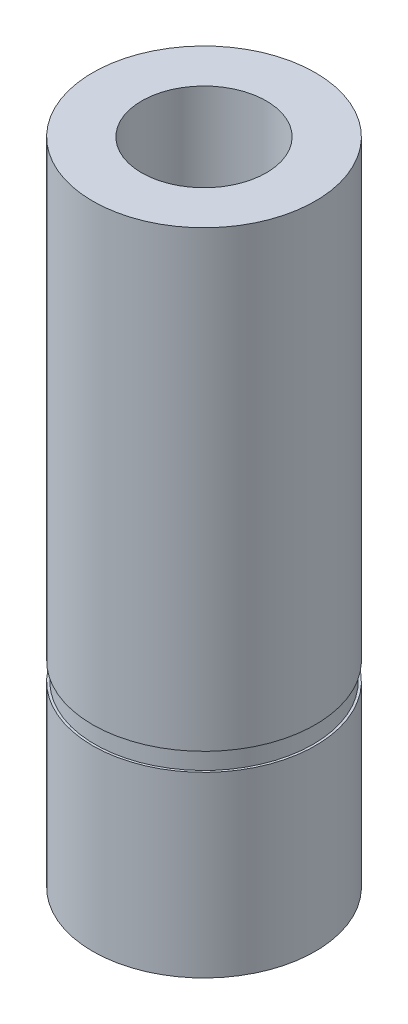
ISO-10303-21;
HEADER;
FILE_DESCRIPTION(('STEP AP214'),'2;1');
FILE_NAME('part.step','',(''),(''),'','','');
FILE_SCHEMA(('AUTOMOTIVE_DESIGN { 1 0 10303 214 1 1 1 1 }'));
ENDSEC;
DATA;
#1=APPLICATION_CONTEXT('core data for automotive mechanical design processes');
#2=APPLICATION_PROTOCOL_DEFINITION('international standard','automotive_design',2000,#1);
#3=PRODUCT_CONTEXT('',#1,'mechanical');
#4=PRODUCT('Part','Part','',(#3));
#5=PRODUCT_RELATED_PRODUCT_CATEGORY('part','',(#4));
#6=PRODUCT_DEFINITION_FORMATION('','',#4);
#7=PRODUCT_DEFINITION_CONTEXT('part definition',#1,'design');
#8=PRODUCT_DEFINITION('design','',#6,#7);
#9=PRODUCT_DEFINITION_SHAPE('','',#8);
#10=(LENGTH_UNIT() NAMED_UNIT(*) SI_UNIT(.MILLI.,.METRE.));
#11=(NAMED_UNIT(*) PLANE_ANGLE_UNIT() SI_UNIT($,.RADIAN.));
#12=(NAMED_UNIT(*) SI_UNIT($,.STERADIAN.) SOLID_ANGLE_UNIT());
#13=UNCERTAINTY_MEASURE_WITH_UNIT(LENGTH_MEASURE(1.E-05),#10,'distance_accuracy_value','');
#14=(GEOMETRIC_REPRESENTATION_CONTEXT(3) GLOBAL_UNCERTAINTY_ASSIGNED_CONTEXT((#13)) GLOBAL_UNIT_ASSIGNED_CONTEXT((#10,
#11,#12)) REPRESENTATION_CONTEXT('',''));
#15=CARTESIAN_POINT('',(0.,0.,0.));
#16=DIRECTION('',(0.,0.,1.));
#17=DIRECTION('',(1.,0.,0.));
#18=AXIS2_PLACEMENT_3D('',#15,#16,#17);
#19=CARTESIAN_POINT('',(0.,17.875,0.));
#20=DIRECTION('',(0.,-1.,0.));
#21=DIRECTION('',(0.,0.,-1.));
#22=AXIS2_PLACEMENT_3D('',#19,#20,#21);
#23=CYLINDRICAL_SURFACE('',#22,6.125);
#24=CARTESIAN_POINT('',(0.,17.875,0.));
#25=DIRECTION('',(0.,1.,0.));
#26=DIRECTION('',(0.,0.,1.));
#27=AXIS2_PLACEMENT_3D('',#24,#25,#26);
#28=CIRCLE('',#27,6.125);
#29=CARTESIAN_POINT('',(0.,17.875,6.125));
#30=VERTEX_POINT('',#29);
#31=EDGE_CURVE('E11',#30,#30,#28,.T.);
#32=ORIENTED_EDGE('',*,*,#31,.F.);
#33=EDGE_LOOP('',(#32));
#34=FACE_BOUND('',#33,.T.);
#35=CARTESIAN_POINT('',(0.,-7.075,0.));
#36=DIRECTION('',(0.,-1.,0.));
#37=DIRECTION('',(0.,0.,-1.));
#38=AXIS2_PLACEMENT_3D('',#35,#36,#37);
#39=CIRCLE('',#38,6.125);
#40=CARTESIAN_POINT('',(0.,-7.075,-6.125));
#41=VERTEX_POINT('',#40);
#42=EDGE_CURVE('E47',#41,#41,#39,.T.);
#43=ORIENTED_EDGE('',*,*,#42,.F.);
#44=EDGE_LOOP('',(#43));
#45=FACE_BOUND('',#44,.T.);
#46=ADVANCED_FACE('F43',(#34,#45),#23,.T.);
#47=CARTESIAN_POINT('',(0.,17.875,0.));
#48=DIRECTION('',(0.,1.,0.));
#49=DIRECTION('',(0.,0.,1.));
#50=AXIS2_PLACEMENT_3D('',#47,#48,#49);
#51=PLANE('',#50);
#52=ORIENTED_EDGE('',*,*,#31,.T.);
#53=EDGE_LOOP('',(#52));
#54=FACE_BOUND('',#53,.T.);
#55=CARTESIAN_POINT('',(0.,17.875,0.));
#56=DIRECTION('',(0.,1.,0.));
#57=DIRECTION('',(0.,0.,1.));
#58=AXIS2_PLACEMENT_3D('',#55,#56,#57);
#59=CIRCLE('',#58,3.43);
#60=CARTESIAN_POINT('',(0.,17.875,3.43));
#61=VERTEX_POINT('',#60);
#62=EDGE_CURVE('E58',#61,#61,#59,.T.);
#63=ORIENTED_EDGE('',*,*,#62,.F.);
#64=EDGE_LOOP('',(#63));
#65=FACE_BOUND('',#64,.T.);
#66=ADVANCED_FACE('F104',(#54,#65),#51,.T.);
#67=CARTESIAN_POINT('',(0.,-17.875,0.));
#68=DIRECTION('',(0.,1.,0.));
#69=DIRECTION('',(0.,0.,1.));
#70=AXIS2_PLACEMENT_3D('',#67,#68,#69);
#71=PLANE('',#70);
#72=CARTESIAN_POINT('',(0.,-17.875,0.));
#73=DIRECTION('',(0.,1.,0.));
#74=DIRECTION('',(0.,0.,1.));
#75=AXIS2_PLACEMENT_3D('',#72,#73,#74);
#76=CIRCLE('',#75,6.125);
#77=CARTESIAN_POINT('',(0.,-17.875,6.125));
#78=VERTEX_POINT('',#77);
#79=EDGE_CURVE('E52',#78,#78,#76,.T.);
#80=ORIENTED_EDGE('',*,*,#79,.F.);
#81=EDGE_LOOP('',(#80));
#82=FACE_BOUND('',#81,.T.);
#83=CARTESIAN_POINT('',(0.,-17.875,0.));
#84=DIRECTION('',(0.,1.,0.));
#85=DIRECTION('',(0.,0.,1.));
#86=AXIS2_PLACEMENT_3D('',#83,#84,#85);
#87=CIRCLE('',#86,3.43);
#88=CARTESIAN_POINT('',(0.,-17.875,3.43));
#89=VERTEX_POINT('',#88);
#90=EDGE_CURVE('E61',#89,#89,#87,.T.);
#91=ORIENTED_EDGE('',*,*,#90,.T.);
#92=EDGE_LOOP('',(#91));
#93=FACE_BOUND('',#92,.T.);
#94=ADVANCED_FACE('F88',(#82,#93),#71,.F.);
#95=CARTESIAN_POINT('',(0.,-8.075,0.));
#96=DIRECTION('',(0.,-1.,0.));
#97=DIRECTION('',(0.,0.,-1.));
#98=AXIS2_PLACEMENT_3D('',#95,#96,#97);
#99=CIRCLE('',#98,6.125);
#100=CARTESIAN_POINT('',(0.,-8.075,-6.125));
#101=VERTEX_POINT('',#100);
#102=EDGE_CURVE('E63',#101,#101,#99,.T.);
#103=ORIENTED_EDGE('',*,*,#102,.T.);
#104=EDGE_LOOP('',(#103));
#105=FACE_BOUND('',#104,.T.);
#106=ORIENTED_EDGE('',*,*,#79,.T.);
#107=EDGE_LOOP('',(#106));
#108=FACE_BOUND('',#107,.T.);
#109=ADVANCED_FACE('F45',(#105,#108),#23,.T.);
#110=CARTESIAN_POINT('',(0.,17.875,0.));
#111=DIRECTION('',(0.,-1.,0.));
#112=DIRECTION('',(0.,0.,-1.));
#113=AXIS2_PLACEMENT_3D('',#110,#111,#112);
#114=CYLINDRICAL_SURFACE('',#113,3.43);
#115=ORIENTED_EDGE('',*,*,#62,.T.);
#116=EDGE_LOOP('',(#115));
#117=FACE_BOUND('',#116,.T.);
#118=ORIENTED_EDGE('',*,*,#90,.F.);
#119=EDGE_LOOP('',(#118));
#120=FACE_BOUND('',#119,.T.);
#121=ADVANCED_FACE('F90',(#117,#120),#114,.F.);
#122=CARTESIAN_POINT('',(0.,-7.075,0.));
#123=DIRECTION('',(0.,-1.,0.));
#124=DIRECTION('',(0.,0.,-1.));
#125=AXIS2_PLACEMENT_3D('',#122,#123,#124);
#126=PLANE('',#125);
#127=CARTESIAN_POINT('',(0.,-7.075,0.));
#128=DIRECTION('',(0.,-1.,0.));
#129=DIRECTION('',(1.,0.,0.));
#130=AXIS2_PLACEMENT_3D('',#127,#128,#129);
#131=CIRCLE('',#130,6.);
#132=CARTESIAN_POINT('',(6.,-7.075,0.));
#133=VERTEX_POINT('',#132);
#134=EDGE_CURVE('E66',#133,#133,#131,.T.);
#135=ORIENTED_EDGE('',*,*,#134,.F.);
#136=EDGE_LOOP('',(#135));
#137=FACE_BOUND('',#136,.T.);
#138=ORIENTED_EDGE('',*,*,#42,.T.);
#139=EDGE_LOOP('',(#138));
#140=FACE_BOUND('',#139,.T.);
#141=ADVANCED_FACE('F92',(#137,#140),#126,.T.);
#142=CARTESIAN_POINT('',(0.,-8.075,0.));
#143=DIRECTION('',(0.,-1.,0.));
#144=DIRECTION('',(0.,0.,-1.));
#145=AXIS2_PLACEMENT_3D('',#142,#143,#144);
#146=PLANE('',#145);
#147=CARTESIAN_POINT('',(0.,-8.075,0.));
#148=DIRECTION('',(0.,-1.,0.));
#149=DIRECTION('',(1.,0.,0.));
#150=AXIS2_PLACEMENT_3D('',#147,#148,#149);
#151=CIRCLE('',#150,6.);
#152=CARTESIAN_POINT('',(6.,-8.075,0.));
#153=VERTEX_POINT('',#152);
#154=EDGE_CURVE('E73',#153,#153,#151,.T.);
#155=ORIENTED_EDGE('',*,*,#154,.T.);
#156=EDGE_LOOP('',(#155));
#157=FACE_BOUND('',#156,.T.);
#158=ORIENTED_EDGE('',*,*,#102,.F.);
#159=EDGE_LOOP('',(#158));
#160=FACE_BOUND('',#159,.T.);
#161=ADVANCED_FACE('F98',(#157,#160),#146,.F.);
#162=CARTESIAN_POINT('',(0.,-7.075,0.));
#163=DIRECTION('',(0.,-1.,0.));
#164=DIRECTION('',(0.,0.,-1.));
#165=AXIS2_PLACEMENT_3D('',#162,#163,#164);
#166=CYLINDRICAL_SURFACE('',#165,6.);
#167=ORIENTED_EDGE('',*,*,#134,.T.);
#168=EDGE_LOOP('',(#167));
#169=FACE_BOUND('',#168,.T.);
#170=ORIENTED_EDGE('',*,*,#154,.F.);
#171=EDGE_LOOP('',(#170));
#172=FACE_BOUND('',#171,.T.);
#173=ADVANCED_FACE('F143',(#169,#172),#166,.T.);
#174=CLOSED_SHELL('',(#46,#66,#94,#109,#121,#141,#161,#173));
#175=MANIFOLD_SOLID_BREP('B2',#174);
#176=ADVANCED_BREP_SHAPE_REPRESENTATION('',(#18,#175),#14);
#177=SHAPE_DEFINITION_REPRESENTATION(#9,#176);
ENDSEC;
END-ISO-10303-21;
